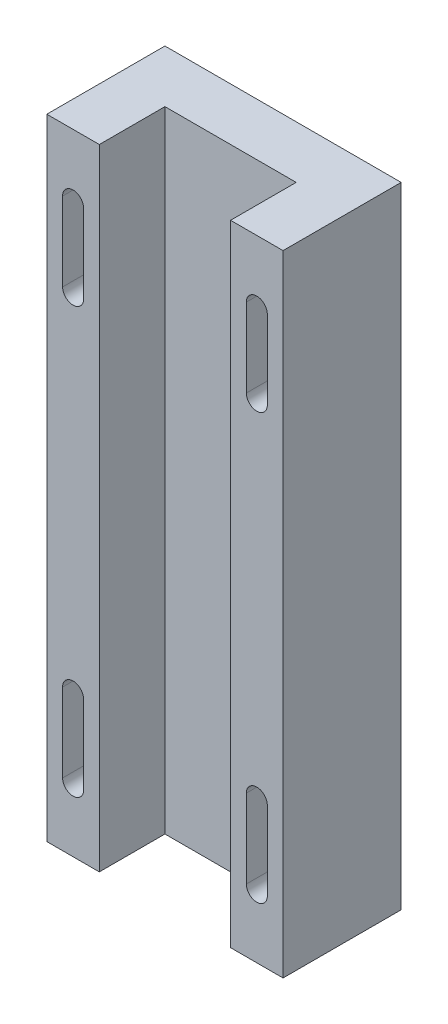
ISO-10303-21;
HEADER;
FILE_DESCRIPTION(('STEP AP214'),'2;1');
FILE_NAME('part.step','',(''),(''),'','','');
FILE_SCHEMA(('AUTOMOTIVE_DESIGN { 1 0 10303 214 1 1 1 1 }'));
ENDSEC;
DATA;
#1=APPLICATION_CONTEXT('core data for automotive mechanical design processes');
#2=APPLICATION_PROTOCOL_DEFINITION('international standard','automotive_design',2000,#1);
#3=PRODUCT_CONTEXT('',#1,'mechanical');
#4=PRODUCT('Part','Part','',(#3));
#5=PRODUCT_RELATED_PRODUCT_CATEGORY('part','',(#4));
#6=PRODUCT_DEFINITION_FORMATION('','',#4);
#7=PRODUCT_DEFINITION_CONTEXT('part definition',#1,'design');
#8=PRODUCT_DEFINITION('design','',#6,#7);
#9=PRODUCT_DEFINITION_SHAPE('','',#8);
#10=(LENGTH_UNIT() NAMED_UNIT(*) SI_UNIT(.MILLI.,.METRE.));
#11=(NAMED_UNIT(*) PLANE_ANGLE_UNIT() SI_UNIT($,.RADIAN.));
#12=(NAMED_UNIT(*) SI_UNIT($,.STERADIAN.) SOLID_ANGLE_UNIT());
#13=UNCERTAINTY_MEASURE_WITH_UNIT(LENGTH_MEASURE(1.E-05),#10,'distance_accuracy_value','');
#14=(GEOMETRIC_REPRESENTATION_CONTEXT(3) GLOBAL_UNCERTAINTY_ASSIGNED_CONTEXT((#13)) GLOBAL_UNIT_ASSIGNED_CONTEXT((#10,
#11,#12)) REPRESENTATION_CONTEXT('',''));
#15=CARTESIAN_POINT('',(0.,0.,0.));
#16=DIRECTION('',(0.,0.,1.));
#17=DIRECTION('',(1.,0.,0.));
#18=AXIS2_PLACEMENT_3D('',#15,#16,#17);
#19=CARTESIAN_POINT('',(0.,120.,0.));
#20=DIRECTION('',(0.,0.,1.));
#21=DIRECTION('',(1.,0.,0.));
#22=AXIS2_PLACEMENT_3D('',#19,#20,#21);
#23=PLANE('',#22);
#24=CARTESIAN_POINT('',(-5.00000000000015,108.,0.));
#25=DIRECTION('',(0.,0.,1.));
#26=DIRECTION('',(1.,0.,0.));
#27=AXIS2_PLACEMENT_3D('',#24,#25,#26);
#28=CIRCLE('',#27,2.);
#29=CARTESIAN_POINT('',(-3.00000000000015,108.,0.));
#30=VERTEX_POINT('',#29);
#31=CARTESIAN_POINT('',(-7.00000000000015,108.,0.));
#32=VERTEX_POINT('',#31);
#33=EDGE_CURVE('E301',#30,#32,#28,.T.);
#34=ORIENTED_EDGE('',*,*,#33,.F.);
#35=DIRECTION('',(0.,-1.,0.));
#36=VECTOR('',#35,1.);
#37=CARTESIAN_POINT('',(-3.00000000000015,108.,0.));
#38=LINE('',#37,#36);
#39=CARTESIAN_POINT('',(-3.00000000000036,93.0000000000002,0.));
#40=VERTEX_POINT('',#39);
#41=EDGE_CURVE('E320',#30,#40,#38,.T.);
#42=ORIENTED_EDGE('',*,*,#41,.T.);
#43=CARTESIAN_POINT('',(-5.00000000000036,93.0000000000003,0.));
#44=DIRECTION('',(0.,0.,-1.));
#45=DIRECTION('',(-1.,0.,0.));
#46=AXIS2_PLACEMENT_3D('',#43,#44,#45);
#47=CIRCLE('',#46,2.);
#48=CARTESIAN_POINT('',(-7.00000000000036,93.0000000000003,0.));
#49=VERTEX_POINT('',#48);
#50=EDGE_CURVE('E324',#40,#49,#47,.T.);
#51=ORIENTED_EDGE('',*,*,#50,.T.);
#52=DIRECTION('',(0.,-1.,0.));
#53=VECTOR('',#52,1.);
#54=CARTESIAN_POINT('',(-7.00000000000015,108.,0.));
#55=LINE('',#54,#53);
#56=EDGE_CURVE('E307',#32,#49,#55,.T.);
#57=ORIENTED_EDGE('',*,*,#56,.F.);
#58=EDGE_LOOP('',(#34,#42,#51,#57));
#59=FACE_BOUND('',#58,.T.);
#60=DIRECTION('',(-1.,0.,0.));
#61=VECTOR('',#60,1.);
#62=CARTESIAN_POINT('',(0.,0.,0.));
#63=LINE('',#62,#61);
#64=CARTESIAN_POINT('',(0.,0.,0.));
#65=VERTEX_POINT('',#64);
#66=CARTESIAN_POINT('',(-10.,0.,0.));
#67=VERTEX_POINT('',#66);
#68=EDGE_CURVE('E388',#65,#67,#63,.T.);
#69=ORIENTED_EDGE('',*,*,#68,.F.);
#70=DIRECTION('',(0.,-1.,0.));
#71=VECTOR('',#70,1.);
#72=CARTESIAN_POINT('',(0.,120.,0.));
#73=LINE('',#72,#71);
#74=CARTESIAN_POINT('',(0.,120.,0.));
#75=VERTEX_POINT('',#74);
#76=EDGE_CURVE('E11',#75,#65,#73,.T.);
#77=ORIENTED_EDGE('',*,*,#76,.F.);
#78=DIRECTION('',(-1.,0.,0.));
#79=VECTOR('',#78,1.);
#80=CARTESIAN_POINT('',(0.,120.,0.));
#81=LINE('',#80,#79);
#82=CARTESIAN_POINT('',(-10.,120.,0.));
#83=VERTEX_POINT('',#82);
#84=EDGE_CURVE('E389',#75,#83,#81,.T.);
#85=ORIENTED_EDGE('',*,*,#84,.T.);
#86=DIRECTION('',(0.,-1.,0.));
#87=VECTOR('',#86,1.);
#88=CARTESIAN_POINT('',(-10.,120.,0.));
#89=LINE('',#88,#87);
#90=EDGE_CURVE('E50',#83,#67,#89,.T.);
#91=ORIENTED_EDGE('',*,*,#90,.T.);
#92=EDGE_LOOP('',(#69,#77,#85,#91));
#93=FACE_BOUND('',#92,.T.);
#94=DIRECTION('',(0.,1.,0.));
#95=VECTOR('',#94,1.);
#96=CARTESIAN_POINT('',(-3.00000000000015,11.9999999999998,0.));
#97=LINE('',#96,#95);
#98=CARTESIAN_POINT('',(-3.00000000000015,11.9999999999998,0.));
#99=VERTEX_POINT('',#98);
#100=CARTESIAN_POINT('',(-3.00000000000036,26.9999999999998,0.));
#101=VERTEX_POINT('',#100);
#102=EDGE_CURVE('E265',#99,#101,#97,.T.);
#103=ORIENTED_EDGE('',*,*,#102,.F.);
#104=CARTESIAN_POINT('',(-5.00000000000015,11.9999999999997,0.));
#105=DIRECTION('',(0.,0.,-1.));
#106=DIRECTION('',(1.,0.,0.));
#107=AXIS2_PLACEMENT_3D('',#104,#105,#106);
#108=CIRCLE('',#107,2.);
#109=CARTESIAN_POINT('',(-7.00000000000015,11.9999999999997,0.));
#110=VERTEX_POINT('',#109);
#111=EDGE_CURVE('E72',#99,#110,#108,.T.);
#112=ORIENTED_EDGE('',*,*,#111,.T.);
#113=DIRECTION('',(0.,1.,0.));
#114=VECTOR('',#113,1.);
#115=CARTESIAN_POINT('',(-7.00000000000015,11.9999999999997,0.));
#116=LINE('',#115,#114);
#117=CARTESIAN_POINT('',(-7.00000000000036,26.9999999999997,0.));
#118=VERTEX_POINT('',#117);
#119=EDGE_CURVE('E279',#110,#118,#116,.T.);
#120=ORIENTED_EDGE('',*,*,#119,.T.);
#121=CARTESIAN_POINT('',(-5.00000000000036,26.9999999999997,0.));
#122=DIRECTION('',(0.,0.,1.));
#123=DIRECTION('',(-1.,0.,0.));
#124=AXIS2_PLACEMENT_3D('',#121,#122,#123);
#125=CIRCLE('',#124,2.);
#126=EDGE_CURVE('E283',#101,#118,#125,.T.);
#127=ORIENTED_EDGE('',*,*,#126,.F.);
#128=EDGE_LOOP('',(#103,#112,#120,#127));
#129=FACE_BOUND('',#128,.T.);
#130=ADVANCED_FACE('F47',(#59,#93,#129),#23,.T.);
#131=CARTESIAN_POINT('',(35.,120.,0.));
#132=DIRECTION('',(0.,0.,1.));
#133=DIRECTION('',(1.,0.,0.));
#134=AXIS2_PLACEMENT_3D('',#131,#132,#133);
#135=PLANE('',#134);
#136=CARTESIAN_POINT('',(30.,12.,0.));
#137=DIRECTION('',(0.,0.,1.));
#138=DIRECTION('',(-1.,0.,0.));
#139=AXIS2_PLACEMENT_3D('',#136,#137,#138);
#140=CIRCLE('',#139,2.);
#141=CARTESIAN_POINT('',(28.,12.,0.));
#142=VERTEX_POINT('',#141);
#143=CARTESIAN_POINT('',(32.,12.,0.));
#144=VERTEX_POINT('',#143);
#145=EDGE_CURVE('E64',#142,#144,#140,.T.);
#146=ORIENTED_EDGE('',*,*,#145,.F.);
#147=DIRECTION('',(0.,1.,0.));
#148=VECTOR('',#147,1.);
#149=CARTESIAN_POINT('',(28.,12.,0.));
#150=LINE('',#149,#148);
#151=CARTESIAN_POINT('',(28.,27.,0.));
#152=VERTEX_POINT('',#151);
#153=EDGE_CURVE('E215',#142,#152,#150,.T.);
#154=ORIENTED_EDGE('',*,*,#153,.T.);
#155=CARTESIAN_POINT('',(30.,27.,0.));
#156=DIRECTION('',(0.,0.,-1.));
#157=DIRECTION('',(1.,0.,0.));
#158=AXIS2_PLACEMENT_3D('',#155,#156,#157);
#159=CIRCLE('',#158,2.);
#160=CARTESIAN_POINT('',(32.,27.,0.));
#161=VERTEX_POINT('',#160);
#162=EDGE_CURVE('E238',#152,#161,#159,.T.);
#163=ORIENTED_EDGE('',*,*,#162,.T.);
#164=DIRECTION('',(0.,1.,0.));
#165=VECTOR('',#164,1.);
#166=CARTESIAN_POINT('',(32.,12.,0.));
#167=LINE('',#166,#165);
#168=EDGE_CURVE('E233',#144,#161,#167,.T.);
#169=ORIENTED_EDGE('',*,*,#168,.F.);
#170=EDGE_LOOP('',(#146,#154,#163,#169));
#171=FACE_BOUND('',#170,.T.);
#172=DIRECTION('',(-1.,0.,0.));
#173=VECTOR('',#172,1.);
#174=CARTESIAN_POINT('',(35.,0.,0.));
#175=LINE('',#174,#173);
#176=CARTESIAN_POINT('',(35.,0.,0.));
#177=VERTEX_POINT('',#176);
#178=CARTESIAN_POINT('',(25.,0.,0.));
#179=VERTEX_POINT('',#178);
#180=EDGE_CURVE('E437',#177,#179,#175,.T.);
#181=ORIENTED_EDGE('',*,*,#180,.F.);
#182=DIRECTION('',(0.,-1.,0.));
#183=VECTOR('',#182,1.);
#184=CARTESIAN_POINT('',(35.,120.,0.));
#185=LINE('',#184,#183);
#186=CARTESIAN_POINT('',(35.,120.,0.));
#187=VERTEX_POINT('',#186);
#188=EDGE_CURVE('E460',#187,#177,#185,.T.);
#189=ORIENTED_EDGE('',*,*,#188,.F.);
#190=DIRECTION('',(-1.,0.,0.));
#191=VECTOR('',#190,1.);
#192=CARTESIAN_POINT('',(35.,120.,0.));
#193=LINE('',#192,#191);
#194=CARTESIAN_POINT('',(25.,120.,0.));
#195=VERTEX_POINT('',#194);
#196=EDGE_CURVE('E406',#187,#195,#193,.T.);
#197=ORIENTED_EDGE('',*,*,#196,.T.);
#198=DIRECTION('',(0.,-1.,0.));
#199=VECTOR('',#198,1.);
#200=CARTESIAN_POINT('',(25.,120.,0.));
#201=LINE('',#200,#199);
#202=EDGE_CURVE('E457',#195,#179,#201,.T.);
#203=ORIENTED_EDGE('',*,*,#202,.T.);
#204=EDGE_LOOP('',(#181,#189,#197,#203));
#205=FACE_BOUND('',#204,.T.);
#206=DIRECTION('',(0.,-1.,0.));
#207=VECTOR('',#206,1.);
#208=CARTESIAN_POINT('',(28.,108.,0.));
#209=LINE('',#208,#207);
#210=CARTESIAN_POINT('',(28.,108.,0.));
#211=VERTEX_POINT('',#210);
#212=CARTESIAN_POINT('',(28.,93.,0.));
#213=VERTEX_POINT('',#212);
#214=EDGE_CURVE('E349',#211,#213,#209,.T.);
#215=ORIENTED_EDGE('',*,*,#214,.F.);
#216=CARTESIAN_POINT('',(30.,108.,0.));
#217=DIRECTION('',(0.,0.,-1.));
#218=DIRECTION('',(-1.,0.,0.));
#219=AXIS2_PLACEMENT_3D('',#216,#217,#218);
#220=CIRCLE('',#219,2.);
#221=CARTESIAN_POINT('',(32.,108.,0.));
#222=VERTEX_POINT('',#221);
#223=EDGE_CURVE('E343',#211,#222,#220,.T.);
#224=ORIENTED_EDGE('',*,*,#223,.T.);
#225=DIRECTION('',(0.,-1.,0.));
#226=VECTOR('',#225,1.);
#227=CARTESIAN_POINT('',(32.,108.,0.));
#228=LINE('',#227,#226);
#229=CARTESIAN_POINT('',(32.,93.,0.));
#230=VERTEX_POINT('',#229);
#231=EDGE_CURVE('E364',#222,#230,#228,.T.);
#232=ORIENTED_EDGE('',*,*,#231,.T.);
#233=CARTESIAN_POINT('',(30.,93.,0.));
#234=DIRECTION('',(0.,0.,1.));
#235=DIRECTION('',(1.,0.,0.));
#236=AXIS2_PLACEMENT_3D('',#233,#234,#235);
#237=CIRCLE('',#236,2.);
#238=EDGE_CURVE('E368',#213,#230,#237,.T.);
#239=ORIENTED_EDGE('',*,*,#238,.F.);
#240=EDGE_LOOP('',(#215,#224,#232,#239));
#241=FACE_BOUND('',#240,.T.);
#242=ADVANCED_FACE('F499',(#171,#205,#241),#135,.T.);
#243=CARTESIAN_POINT('',(0.,120.,-12.5));
#244=DIRECTION('',(1.,0.,0.));
#245=DIRECTION('',(0.,0.,-1.));
#246=AXIS2_PLACEMENT_3D('',#243,#244,#245);
#247=PLANE('',#246);
#248=DIRECTION('',(0.,0.,1.));
#249=VECTOR('',#248,1.);
#250=CARTESIAN_POINT('',(0.,0.,-12.5));
#251=LINE('',#250,#249);
#252=CARTESIAN_POINT('',(0.,0.,-12.5));
#253=VERTEX_POINT('',#252);
#254=EDGE_CURVE('E394',#253,#65,#251,.T.);
#255=ORIENTED_EDGE('',*,*,#254,.F.);
#256=DIRECTION('',(0.,-1.,0.));
#257=VECTOR('',#256,1.);
#258=CARTESIAN_POINT('',(0.,120.,-12.5));
#259=LINE('',#258,#257);
#260=CARTESIAN_POINT('',(0.,120.,-12.5));
#261=VERTEX_POINT('',#260);
#262=EDGE_CURVE('E56',#261,#253,#259,.T.);
#263=ORIENTED_EDGE('',*,*,#262,.F.);
#264=DIRECTION('',(0.,0.,1.));
#265=VECTOR('',#264,1.);
#266=CARTESIAN_POINT('',(0.,120.,-12.5));
#267=LINE('',#266,#265);
#268=EDGE_CURVE('E418',#261,#75,#267,.T.);
#269=ORIENTED_EDGE('',*,*,#268,.T.);
#270=ORIENTED_EDGE('',*,*,#76,.T.);
#271=EDGE_LOOP('',(#255,#263,#269,#270));
#272=FACE_BOUND('',#271,.T.);
#273=ADVANCED_FACE('F484',(#272),#247,.T.);
#274=CARTESIAN_POINT('',(25.,120.,-12.5));
#275=DIRECTION('',(0.,0.,1.));
#276=DIRECTION('',(1.,0.,0.));
#277=AXIS2_PLACEMENT_3D('',#274,#275,#276);
#278=PLANE('',#277);
#279=DIRECTION('',(-1.,0.,0.));
#280=VECTOR('',#279,1.);
#281=CARTESIAN_POINT('',(25.,0.,-12.5));
#282=LINE('',#281,#280);
#283=CARTESIAN_POINT('',(25.,0.,-12.5));
#284=VERTEX_POINT('',#283);
#285=EDGE_CURVE('E445',#284,#253,#282,.T.);
#286=ORIENTED_EDGE('',*,*,#285,.F.);
#287=DIRECTION('',(0.,-1.,0.));
#288=VECTOR('',#287,1.);
#289=CARTESIAN_POINT('',(25.,120.,-12.5));
#290=LINE('',#289,#288);
#291=CARTESIAN_POINT('',(25.,120.,-12.5));
#292=VERTEX_POINT('',#291);
#293=EDGE_CURVE('E454',#292,#284,#290,.T.);
#294=ORIENTED_EDGE('',*,*,#293,.F.);
#295=DIRECTION('',(-1.,0.,0.));
#296=VECTOR('',#295,1.);
#297=CARTESIAN_POINT('',(25.,120.,-12.5));
#298=LINE('',#297,#296);
#299=EDGE_CURVE('E414',#292,#261,#298,.T.);
#300=ORIENTED_EDGE('',*,*,#299,.T.);
#301=ORIENTED_EDGE('',*,*,#262,.T.);
#302=EDGE_LOOP('',(#286,#294,#300,#301));
#303=FACE_BOUND('',#302,.T.);
#304=ADVANCED_FACE('F506',(#303),#278,.T.);
#305=CARTESIAN_POINT('',(25.,120.,0.));
#306=DIRECTION('',(-1.,0.,0.));
#307=DIRECTION('',(0.,0.,1.));
#308=AXIS2_PLACEMENT_3D('',#305,#306,#307);
#309=PLANE('',#308);
#310=DIRECTION('',(0.,0.,-1.));
#311=VECTOR('',#310,1.);
#312=CARTESIAN_POINT('',(25.,0.,0.));
#313=LINE('',#312,#311);
#314=EDGE_CURVE('E441',#179,#284,#313,.T.);
#315=ORIENTED_EDGE('',*,*,#314,.F.);
#316=ORIENTED_EDGE('',*,*,#202,.F.);
#317=DIRECTION('',(0.,0.,-1.));
#318=VECTOR('',#317,1.);
#319=CARTESIAN_POINT('',(25.,120.,0.));
#320=LINE('',#319,#318);
#321=EDGE_CURVE('E410',#195,#292,#320,.T.);
#322=ORIENTED_EDGE('',*,*,#321,.T.);
#323=ORIENTED_EDGE('',*,*,#293,.T.);
#324=EDGE_LOOP('',(#315,#316,#322,#323));
#325=FACE_BOUND('',#324,.T.);
#326=ADVANCED_FACE('F504',(#325),#309,.T.);
#327=CARTESIAN_POINT('',(35.,120.,-22.5));
#328=DIRECTION('',(1.,0.,0.));
#329=DIRECTION('',(0.,0.,-1.));
#330=AXIS2_PLACEMENT_3D('',#327,#328,#329);
#331=PLANE('',#330);
#332=DIRECTION('',(0.,0.,1.));
#333=VECTOR('',#332,1.);
#334=CARTESIAN_POINT('',(35.,0.,-22.5));
#335=LINE('',#334,#333);
#336=CARTESIAN_POINT('',(35.,0.,-22.5));
#337=VERTEX_POINT('',#336);
#338=EDGE_CURVE('E433',#337,#177,#335,.T.);
#339=ORIENTED_EDGE('',*,*,#338,.F.);
#340=DIRECTION('',(0.,-1.,0.));
#341=VECTOR('',#340,1.);
#342=CARTESIAN_POINT('',(35.,120.,-22.5));
#343=LINE('',#342,#341);
#344=CARTESIAN_POINT('',(35.,120.,-22.5));
#345=VERTEX_POINT('',#344);
#346=EDGE_CURVE('E463',#345,#337,#343,.T.);
#347=ORIENTED_EDGE('',*,*,#346,.F.);
#348=DIRECTION('',(0.,0.,1.));
#349=VECTOR('',#348,1.);
#350=CARTESIAN_POINT('',(35.,120.,-22.5));
#351=LINE('',#350,#349);
#352=EDGE_CURVE('E402',#345,#187,#351,.T.);
#353=ORIENTED_EDGE('',*,*,#352,.T.);
#354=ORIENTED_EDGE('',*,*,#188,.T.);
#355=EDGE_LOOP('',(#339,#347,#353,#354));
#356=FACE_BOUND('',#355,.T.);
#357=ADVANCED_FACE('F497',(#356),#331,.T.);
#358=CARTESIAN_POINT('',(-10.,120.,-22.5));
#359=DIRECTION('',(0.,0.,-1.));
#360=DIRECTION('',(-1.,0.,0.));
#361=AXIS2_PLACEMENT_3D('',#358,#359,#360);
#362=PLANE('',#361);
#363=DIRECTION('',(1.,0.,0.));
#364=VECTOR('',#363,1.);
#365=CARTESIAN_POINT('',(-10.,0.,-22.5));
#366=LINE('',#365,#364);
#367=CARTESIAN_POINT('',(-10.,0.,-22.5));
#368=VERTEX_POINT('',#367);
#369=EDGE_CURVE('E429',#368,#337,#366,.T.);
#370=ORIENTED_EDGE('',*,*,#369,.F.);
#371=DIRECTION('',(0.,-1.,0.));
#372=VECTOR('',#371,1.);
#373=CARTESIAN_POINT('',(-10.,120.,-22.5));
#374=LINE('',#373,#372);
#375=CARTESIAN_POINT('',(-10.,120.,-22.5));
#376=VERTEX_POINT('',#375);
#377=EDGE_CURVE('E465',#376,#368,#374,.T.);
#378=ORIENTED_EDGE('',*,*,#377,.F.);
#379=DIRECTION('',(1.,0.,0.));
#380=VECTOR('',#379,1.);
#381=CARTESIAN_POINT('',(-10.,120.,-22.5));
#382=LINE('',#381,#380);
#383=EDGE_CURVE('E398',#376,#345,#382,.T.);
#384=ORIENTED_EDGE('',*,*,#383,.T.);
#385=ORIENTED_EDGE('',*,*,#346,.T.);
#386=EDGE_LOOP('',(#370,#378,#384,#385));
#387=FACE_BOUND('',#386,.T.);
#388=ADVANCED_FACE('F493',(#387),#362,.T.);
#389=CARTESIAN_POINT('',(-10.,120.,0.));
#390=DIRECTION('',(-1.,0.,0.));
#391=DIRECTION('',(0.,0.,1.));
#392=AXIS2_PLACEMENT_3D('',#389,#390,#391);
#393=PLANE('',#392);
#394=DIRECTION('',(0.,0.,-1.));
#395=VECTOR('',#394,1.);
#396=CARTESIAN_POINT('',(-10.,0.,0.));
#397=LINE('',#396,#395);
#398=EDGE_CURVE('E425',#67,#368,#397,.T.);
#399=ORIENTED_EDGE('',*,*,#398,.F.);
#400=ORIENTED_EDGE('',*,*,#90,.F.);
#401=DIRECTION('',(0.,0.,-1.));
#402=VECTOR('',#401,1.);
#403=CARTESIAN_POINT('',(-10.,120.,0.));
#404=LINE('',#403,#402);
#405=EDGE_CURVE('E393',#83,#376,#404,.T.);
#406=ORIENTED_EDGE('',*,*,#405,.T.);
#407=ORIENTED_EDGE('',*,*,#377,.T.);
#408=EDGE_LOOP('',(#399,#400,#406,#407));
#409=FACE_BOUND('',#408,.T.);
#410=ADVANCED_FACE('F478',(#409),#393,.T.);
#411=CARTESIAN_POINT('',(0.,120.,0.));
#412=DIRECTION('',(0.,-1.,0.));
#413=DIRECTION('',(0.,0.,-1.));
#414=AXIS2_PLACEMENT_3D('',#411,#412,#413);
#415=PLANE('',#414);
#416=ORIENTED_EDGE('',*,*,#84,.F.);
#417=ORIENTED_EDGE('',*,*,#268,.F.);
#418=ORIENTED_EDGE('',*,*,#299,.F.);
#419=ORIENTED_EDGE('',*,*,#321,.F.);
#420=ORIENTED_EDGE('',*,*,#196,.F.);
#421=ORIENTED_EDGE('',*,*,#352,.F.);
#422=ORIENTED_EDGE('',*,*,#383,.F.);
#423=ORIENTED_EDGE('',*,*,#405,.F.);
#424=EDGE_LOOP('',(#416,#417,#418,#419,#420,#421,#422,#423));
#425=FACE_BOUND('',#424,.T.);
#426=ADVANCED_FACE('F487',(#425),#415,.F.);
#427=CARTESIAN_POINT('',(0.,0.,0.));
#428=DIRECTION('',(0.,-1.,0.));
#429=DIRECTION('',(0.,0.,-1.));
#430=AXIS2_PLACEMENT_3D('',#427,#428,#429);
#431=PLANE('',#430);
#432=ORIENTED_EDGE('',*,*,#68,.T.);
#433=ORIENTED_EDGE('',*,*,#398,.T.);
#434=ORIENTED_EDGE('',*,*,#369,.T.);
#435=ORIENTED_EDGE('',*,*,#338,.T.);
#436=ORIENTED_EDGE('',*,*,#180,.T.);
#437=ORIENTED_EDGE('',*,*,#314,.T.);
#438=ORIENTED_EDGE('',*,*,#285,.T.);
#439=ORIENTED_EDGE('',*,*,#254,.T.);
#440=EDGE_LOOP('',(#432,#433,#434,#435,#436,#437,#438,#439));
#441=FACE_BOUND('',#440,.T.);
#442=ADVANCED_FACE('F480',(#441),#431,.T.);
#443=CARTESIAN_POINT('',(30.,108.,-4.));
#444=DIRECTION('',(0.,0.,1.));
#445=DIRECTION('',(1.,0.,0.));
#446=AXIS2_PLACEMENT_3D('',#443,#444,#445);
#447=CYLINDRICAL_SURFACE('',#446,2.);
#448=ORIENTED_EDGE('',*,*,#223,.F.);
#449=DIRECTION('',(0.,0.,1.));
#450=VECTOR('',#449,1.);
#451=CARTESIAN_POINT('',(28.,108.,-4.));
#452=LINE('',#451,#450);
#453=CARTESIAN_POINT('',(28.,108.,-4.));
#454=VERTEX_POINT('',#453);
#455=EDGE_CURVE('E360',#454,#211,#452,.T.);
#456=ORIENTED_EDGE('',*,*,#455,.F.);
#457=CARTESIAN_POINT('',(30.,108.,-4.));
#458=DIRECTION('',(0.,0.,-1.));
#459=DIRECTION('',(-1.,0.,0.));
#460=AXIS2_PLACEMENT_3D('',#457,#458,#459);
#461=CIRCLE('',#460,2.);
#462=CARTESIAN_POINT('',(32.,108.,-4.));
#463=VERTEX_POINT('',#462);
#464=EDGE_CURVE('E344',#454,#463,#461,.T.);
#465=ORIENTED_EDGE('',*,*,#464,.T.);
#466=DIRECTION('',(0.,0.,1.));
#467=VECTOR('',#466,1.);
#468=CARTESIAN_POINT('',(32.,108.,-4.));
#469=LINE('',#468,#467);
#470=EDGE_CURVE('E384',#463,#222,#469,.T.);
#471=ORIENTED_EDGE('',*,*,#470,.T.);
#472=EDGE_LOOP('',(#448,#456,#465,#471));
#473=FACE_BOUND('',#472,.T.);
#474=ADVANCED_FACE('F570',(#473),#447,.F.);
#475=CARTESIAN_POINT('',(32.,108.,-4.));
#476=DIRECTION('',(-1.,0.,0.));
#477=DIRECTION('',(0.,0.,1.));
#478=AXIS2_PLACEMENT_3D('',#475,#476,#477);
#479=PLANE('',#478);
#480=ORIENTED_EDGE('',*,*,#231,.F.);
#481=ORIENTED_EDGE('',*,*,#470,.F.);
#482=DIRECTION('',(0.,-1.,0.));
#483=VECTOR('',#482,1.);
#484=CARTESIAN_POINT('',(32.,108.,-4.));
#485=LINE('',#484,#483);
#486=CARTESIAN_POINT('',(32.,93.,-4.));
#487=VERTEX_POINT('',#486);
#488=EDGE_CURVE('E348',#463,#487,#485,.T.);
#489=ORIENTED_EDGE('',*,*,#488,.T.);
#490=DIRECTION('',(0.,0.,1.));
#491=VECTOR('',#490,1.);
#492=CARTESIAN_POINT('',(32.,93.,-4.));
#493=LINE('',#492,#491);
#494=EDGE_CURVE('E381',#487,#230,#493,.T.);
#495=ORIENTED_EDGE('',*,*,#494,.T.);
#496=EDGE_LOOP('',(#480,#481,#489,#495));
#497=FACE_BOUND('',#496,.T.);
#498=ADVANCED_FACE('F566',(#497),#479,.T.);
#499=CARTESIAN_POINT('',(30.,93.,-4.));
#500=DIRECTION('',(0.,0.,1.));
#501=DIRECTION('',(1.,0.,0.));
#502=AXIS2_PLACEMENT_3D('',#499,#500,#501);
#503=CYLINDRICAL_SURFACE('',#502,2.);
#504=ORIENTED_EDGE('',*,*,#238,.T.);
#505=ORIENTED_EDGE('',*,*,#494,.F.);
#506=CARTESIAN_POINT('',(30.,93.,-4.));
#507=DIRECTION('',(0.,0.,1.));
#508=DIRECTION('',(1.,0.,0.));
#509=AXIS2_PLACEMENT_3D('',#506,#507,#508);
#510=CIRCLE('',#509,2.);
#511=CARTESIAN_POINT('',(28.,93.,-4.));
#512=VERTEX_POINT('',#511);
#513=EDGE_CURVE('E352',#512,#487,#510,.T.);
#514=ORIENTED_EDGE('',*,*,#513,.F.);
#515=DIRECTION('',(0.,0.,1.));
#516=VECTOR('',#515,1.);
#517=CARTESIAN_POINT('',(28.,93.,-4.));
#518=LINE('',#517,#516);
#519=EDGE_CURVE('E378',#512,#213,#518,.T.);
#520=ORIENTED_EDGE('',*,*,#519,.T.);
#521=EDGE_LOOP('',(#504,#505,#514,#520));
#522=FACE_BOUND('',#521,.T.);
#523=ADVANCED_FACE('F562',(#522),#503,.F.);
#524=CARTESIAN_POINT('',(28.,108.,-4.));
#525=DIRECTION('',(-1.,0.,0.));
#526=DIRECTION('',(0.,-1.,0.));
#527=AXIS2_PLACEMENT_3D('',#524,#525,#526);
#528=PLANE('',#527);
#529=ORIENTED_EDGE('',*,*,#214,.T.);
#530=ORIENTED_EDGE('',*,*,#519,.F.);
#531=DIRECTION('',(0.,-1.,0.));
#532=VECTOR('',#531,1.);
#533=CARTESIAN_POINT('',(28.,108.,-4.));
#534=LINE('',#533,#532);
#535=EDGE_CURVE('E356',#454,#512,#534,.T.);
#536=ORIENTED_EDGE('',*,*,#535,.F.);
#537=ORIENTED_EDGE('',*,*,#455,.T.);
#538=EDGE_LOOP('',(#529,#530,#536,#537));
#539=FACE_BOUND('',#538,.T.);
#540=ADVANCED_FACE('F558',(#539),#528,.F.);
#541=CARTESIAN_POINT('',(30.,108.,-4.));
#542=DIRECTION('',(0.,0.,-1.));
#543=DIRECTION('',(-1.,0.,0.));
#544=AXIS2_PLACEMENT_3D('',#541,#542,#543);
#545=PLANE('',#544);
#546=ORIENTED_EDGE('',*,*,#464,.F.);
#547=ORIENTED_EDGE('',*,*,#535,.T.);
#548=ORIENTED_EDGE('',*,*,#513,.T.);
#549=ORIENTED_EDGE('',*,*,#488,.F.);
#550=EDGE_LOOP('',(#546,#547,#548,#549));
#551=FACE_BOUND('',#550,.T.);
#552=ADVANCED_FACE('F555',(#551),#545,.F.);
#553=CARTESIAN_POINT('',(-5.00000000000015,108.,-3.99999999999997));
#554=DIRECTION('',(0.,0.,1.));
#555=DIRECTION('',(1.,0.,0.));
#556=AXIS2_PLACEMENT_3D('',#553,#554,#555);
#557=CYLINDRICAL_SURFACE('',#556,2.);
#558=ORIENTED_EDGE('',*,*,#33,.T.);
#559=DIRECTION('',(0.,0.,1.));
#560=VECTOR('',#559,1.);
#561=CARTESIAN_POINT('',(-7.00000000000016,108.,-3.99999999999997));
#562=LINE('',#561,#560);
#563=CARTESIAN_POINT('',(-7.00000000000016,108.,-3.99999999999997));
#564=VERTEX_POINT('',#563);
#565=EDGE_CURVE('E317',#564,#32,#562,.T.);
#566=ORIENTED_EDGE('',*,*,#565,.F.);
#567=CARTESIAN_POINT('',(-5.00000000000015,108.,-3.99999999999997));
#568=DIRECTION('',(0.,0.,1.));
#569=DIRECTION('',(1.,0.,0.));
#570=AXIS2_PLACEMENT_3D('',#567,#568,#569);
#571=CIRCLE('',#570,2.);
#572=CARTESIAN_POINT('',(-3.00000000000016,108.,-3.99999999999997));
#573=VERTEX_POINT('',#572);
#574=EDGE_CURVE('E302',#573,#564,#571,.T.);
#575=ORIENTED_EDGE('',*,*,#574,.F.);
#576=DIRECTION('',(0.,0.,1.));
#577=VECTOR('',#576,1.);
#578=CARTESIAN_POINT('',(-3.00000000000016,108.,-3.99999999999997));
#579=LINE('',#578,#577);
#580=EDGE_CURVE('E340',#573,#30,#579,.T.);
#581=ORIENTED_EDGE('',*,*,#580,.T.);
#582=EDGE_LOOP('',(#558,#566,#575,#581));
#583=FACE_BOUND('',#582,.T.);
#584=ADVANCED_FACE('F527',(#583),#557,.F.);
#585=CARTESIAN_POINT('',(-3.00000000000016,108.,-3.99999999999997));
#586=DIRECTION('',(-1.,0.,0.));
#587=DIRECTION('',(0.,-1.,0.));
#588=AXIS2_PLACEMENT_3D('',#585,#586,#587);
#589=PLANE('',#588);
#590=ORIENTED_EDGE('',*,*,#41,.F.);
#591=ORIENTED_EDGE('',*,*,#580,.F.);
#592=DIRECTION('',(0.,-1.,0.));
#593=VECTOR('',#592,1.);
#594=CARTESIAN_POINT('',(-3.00000000000016,108.,-3.99999999999997));
#595=LINE('',#594,#593);
#596=CARTESIAN_POINT('',(-3.00000000000037,93.0000000000002,-3.99999999999997));
#597=VERTEX_POINT('',#596);
#598=EDGE_CURVE('E306',#573,#597,#595,.T.);
#599=ORIENTED_EDGE('',*,*,#598,.T.);
#600=DIRECTION('',(0.,0.,1.));
#601=VECTOR('',#600,1.);
#602=CARTESIAN_POINT('',(-3.00000000000037,93.0000000000002,-3.99999999999997));
#603=LINE('',#602,#601);
#604=EDGE_CURVE('E337',#597,#40,#603,.T.);
#605=ORIENTED_EDGE('',*,*,#604,.T.);
#606=EDGE_LOOP('',(#590,#591,#599,#605));
#607=FACE_BOUND('',#606,.T.);
#608=ADVANCED_FACE('F539',(#607),#589,.T.);
#609=CARTESIAN_POINT('',(-5.00000000000037,93.0000000000003,-3.99999999999997));
#610=DIRECTION('',(0.,0.,1.));
#611=DIRECTION('',(1.,0.,0.));
#612=AXIS2_PLACEMENT_3D('',#609,#610,#611);
#613=CYLINDRICAL_SURFACE('',#612,2.);
#614=ORIENTED_EDGE('',*,*,#50,.F.);
#615=ORIENTED_EDGE('',*,*,#604,.F.);
#616=CARTESIAN_POINT('',(-5.00000000000037,93.0000000000003,-3.99999999999997));
#617=DIRECTION('',(0.,0.,-1.));
#618=DIRECTION('',(-1.,0.,0.));
#619=AXIS2_PLACEMENT_3D('',#616,#617,#618);
#620=CIRCLE('',#619,2.);
#621=CARTESIAN_POINT('',(-7.00000000000036,93.0000000000003,-3.99999999999997));
#622=VERTEX_POINT('',#621);
#623=EDGE_CURVE('E310',#597,#622,#620,.T.);
#624=ORIENTED_EDGE('',*,*,#623,.T.);
#625=DIRECTION('',(0.,0.,1.));
#626=VECTOR('',#625,1.);
#627=CARTESIAN_POINT('',(-7.00000000000036,93.0000000000003,-3.99999999999997));
#628=LINE('',#627,#626);
#629=EDGE_CURVE('E334',#622,#49,#628,.T.);
#630=ORIENTED_EDGE('',*,*,#629,.T.);
#631=EDGE_LOOP('',(#614,#615,#624,#630));
#632=FACE_BOUND('',#631,.T.);
#633=ADVANCED_FACE('F542',(#632),#613,.F.);
#634=CARTESIAN_POINT('',(-7.00000000000016,108.,-3.99999999999997));
#635=DIRECTION('',(-1.,0.,0.));
#636=DIRECTION('',(0.,-1.,0.));
#637=AXIS2_PLACEMENT_3D('',#634,#635,#636);
#638=PLANE('',#637);
#639=ORIENTED_EDGE('',*,*,#56,.T.);
#640=ORIENTED_EDGE('',*,*,#629,.F.);
#641=DIRECTION('',(0.,-1.,0.));
#642=VECTOR('',#641,1.);
#643=CARTESIAN_POINT('',(-7.00000000000016,108.,-3.99999999999997));
#644=LINE('',#643,#642);
#645=EDGE_CURVE('E313',#564,#622,#644,.T.);
#646=ORIENTED_EDGE('',*,*,#645,.F.);
#647=ORIENTED_EDGE('',*,*,#565,.T.);
#648=EDGE_LOOP('',(#639,#640,#646,#647));
#649=FACE_BOUND('',#648,.T.);
#650=ADVANCED_FACE('F531',(#649),#638,.F.);
#651=CARTESIAN_POINT('',(-5.00000000000015,108.,-3.99999999999997));
#652=DIRECTION('',(0.,0.,-1.));
#653=DIRECTION('',(1.,0.,0.));
#654=AXIS2_PLACEMENT_3D('',#651,#652,#653);
#655=PLANE('',#654);
#656=ORIENTED_EDGE('',*,*,#574,.T.);
#657=ORIENTED_EDGE('',*,*,#645,.T.);
#658=ORIENTED_EDGE('',*,*,#623,.F.);
#659=ORIENTED_EDGE('',*,*,#598,.F.);
#660=EDGE_LOOP('',(#656,#657,#658,#659));
#661=FACE_BOUND('',#660,.T.);
#662=ADVANCED_FACE('F535',(#661),#655,.F.);
#663=CARTESIAN_POINT('',(-5.00000000000015,11.9999999999997,-3.99999999999997));
#664=DIRECTION('',(0.,0.,1.));
#665=DIRECTION('',(1.,0.,0.));
#666=AXIS2_PLACEMENT_3D('',#663,#664,#665);
#667=CYLINDRICAL_SURFACE('',#666,2.);
#668=ORIENTED_EDGE('',*,*,#111,.F.);
#669=DIRECTION('',(0.,0.,1.));
#670=VECTOR('',#669,1.);
#671=CARTESIAN_POINT('',(-3.00000000000016,11.9999999999998,-3.99999999999997));
#672=LINE('',#671,#670);
#673=CARTESIAN_POINT('',(-3.00000000000016,11.9999999999998,-3.99999999999997));
#674=VERTEX_POINT('',#673);
#675=EDGE_CURVE('E276',#674,#99,#672,.T.);
#676=ORIENTED_EDGE('',*,*,#675,.F.);
#677=CARTESIAN_POINT('',(-5.00000000000015,11.9999999999997,-3.99999999999997));
#678=DIRECTION('',(0.,0.,-1.));
#679=DIRECTION('',(1.,0.,0.));
#680=AXIS2_PLACEMENT_3D('',#677,#678,#679);
#681=CIRCLE('',#680,2.);
#682=CARTESIAN_POINT('',(-7.00000000000016,11.9999999999997,-3.99999999999997));
#683=VERTEX_POINT('',#682);
#684=EDGE_CURVE('E260',#674,#683,#681,.T.);
#685=ORIENTED_EDGE('',*,*,#684,.T.);
#686=DIRECTION('',(0.,0.,1.));
#687=VECTOR('',#686,1.);
#688=CARTESIAN_POINT('',(-7.00000000000016,11.9999999999997,-3.99999999999997));
#689=LINE('',#688,#687);
#690=EDGE_CURVE('E298',#683,#110,#689,.T.);
#691=ORIENTED_EDGE('',*,*,#690,.T.);
#692=EDGE_LOOP('',(#668,#676,#685,#691));
#693=FACE_BOUND('',#692,.T.);
#694=ADVANCED_FACE('F638',(#693),#667,.F.);
#695=CARTESIAN_POINT('',(-7.00000000000016,11.9999999999997,-3.99999999999997));
#696=DIRECTION('',(1.,0.,0.));
#697=DIRECTION('',(0.,1.,0.));
#698=AXIS2_PLACEMENT_3D('',#695,#696,#697);
#699=PLANE('',#698);
#700=ORIENTED_EDGE('',*,*,#119,.F.);
#701=ORIENTED_EDGE('',*,*,#690,.F.);
#702=DIRECTION('',(0.,1.,0.));
#703=VECTOR('',#702,1.);
#704=CARTESIAN_POINT('',(-7.00000000000016,11.9999999999997,-3.99999999999997));
#705=LINE('',#704,#703);
#706=CARTESIAN_POINT('',(-7.00000000000036,26.9999999999997,-3.99999999999997));
#707=VERTEX_POINT('',#706);
#708=EDGE_CURVE('E264',#683,#707,#705,.T.);
#709=ORIENTED_EDGE('',*,*,#708,.T.);
#710=DIRECTION('',(0.,0.,1.));
#711=VECTOR('',#710,1.);
#712=CARTESIAN_POINT('',(-7.00000000000036,26.9999999999997,-3.99999999999997));
#713=LINE('',#712,#711);
#714=EDGE_CURVE('E295',#707,#118,#713,.T.);
#715=ORIENTED_EDGE('',*,*,#714,.T.);
#716=EDGE_LOOP('',(#700,#701,#709,#715));
#717=FACE_BOUND('',#716,.T.);
#718=ADVANCED_FACE('F650',(#717),#699,.T.);
#719=CARTESIAN_POINT('',(-5.00000000000037,26.9999999999997,-3.99999999999997));
#720=DIRECTION('',(0.,0.,1.));
#721=DIRECTION('',(1.,0.,0.));
#722=AXIS2_PLACEMENT_3D('',#719,#720,#721);
#723=CYLINDRICAL_SURFACE('',#722,2.);
#724=ORIENTED_EDGE('',*,*,#126,.T.);
#725=ORIENTED_EDGE('',*,*,#714,.F.);
#726=CARTESIAN_POINT('',(-5.00000000000037,26.9999999999997,-3.99999999999997));
#727=DIRECTION('',(0.,0.,1.));
#728=DIRECTION('',(-1.,0.,0.));
#729=AXIS2_PLACEMENT_3D('',#726,#727,#728);
#730=CIRCLE('',#729,2.);
#731=CARTESIAN_POINT('',(-3.00000000000037,26.9999999999998,-3.99999999999997));
#732=VERTEX_POINT('',#731);
#733=EDGE_CURVE('E268',#732,#707,#730,.T.);
#734=ORIENTED_EDGE('',*,*,#733,.F.);
#735=DIRECTION('',(0.,0.,1.));
#736=VECTOR('',#735,1.);
#737=CARTESIAN_POINT('',(-3.00000000000037,26.9999999999998,-3.99999999999997));
#738=LINE('',#737,#736);
#739=EDGE_CURVE('E292',#732,#101,#738,.T.);
#740=ORIENTED_EDGE('',*,*,#739,.T.);
#741=EDGE_LOOP('',(#724,#725,#734,#740));
#742=FACE_BOUND('',#741,.T.);
#743=ADVANCED_FACE('F659',(#742),#723,.F.);
#744=CARTESIAN_POINT('',(-3.00000000000016,11.9999999999998,-3.99999999999997));
#745=DIRECTION('',(1.,0.,0.));
#746=DIRECTION('',(0.,1.,0.));
#747=AXIS2_PLACEMENT_3D('',#744,#745,#746);
#748=PLANE('',#747);
#749=ORIENTED_EDGE('',*,*,#102,.T.);
#750=ORIENTED_EDGE('',*,*,#739,.F.);
#751=DIRECTION('',(0.,1.,0.));
#752=VECTOR('',#751,1.);
#753=CARTESIAN_POINT('',(-3.00000000000016,11.9999999999998,-3.99999999999997));
#754=LINE('',#753,#752);
#755=EDGE_CURVE('E272',#674,#732,#754,.T.);
#756=ORIENTED_EDGE('',*,*,#755,.F.);
#757=ORIENTED_EDGE('',*,*,#675,.T.);
#758=EDGE_LOOP('',(#749,#750,#756,#757));
#759=FACE_BOUND('',#758,.T.);
#760=ADVANCED_FACE('F669',(#759),#748,.F.);
#761=CARTESIAN_POINT('',(-5.00000000000015,11.9999999999997,-3.99999999999997));
#762=DIRECTION('',(0.,0.,-1.));
#763=DIRECTION('',(1.,0.,0.));
#764=AXIS2_PLACEMENT_3D('',#761,#762,#763);
#765=PLANE('',#764);
#766=ORIENTED_EDGE('',*,*,#684,.F.);
#767=ORIENTED_EDGE('',*,*,#755,.T.);
#768=ORIENTED_EDGE('',*,*,#733,.T.);
#769=ORIENTED_EDGE('',*,*,#708,.F.);
#770=EDGE_LOOP('',(#766,#767,#768,#769));
#771=FACE_BOUND('',#770,.T.);
#772=ADVANCED_FACE('F679',(#771),#765,.F.);
#773=CARTESIAN_POINT('',(30.,12.,-4.));
#774=DIRECTION('',(0.,0.,1.));
#775=DIRECTION('',(1.,0.,0.));
#776=AXIS2_PLACEMENT_3D('',#773,#774,#775);
#777=CYLINDRICAL_SURFACE('',#776,2.);
#778=ORIENTED_EDGE('',*,*,#145,.T.);
#779=DIRECTION('',(0.,0.,1.));
#780=VECTOR('',#779,1.);
#781=CARTESIAN_POINT('',(32.,12.,-4.));
#782=LINE('',#781,#780);
#783=CARTESIAN_POINT('',(32.,12.,-4.));
#784=VERTEX_POINT('',#783);
#785=EDGE_CURVE('E231',#784,#144,#782,.T.);
#786=ORIENTED_EDGE('',*,*,#785,.F.);
#787=CARTESIAN_POINT('',(30.,12.,-4.));
#788=DIRECTION('',(0.,0.,1.));
#789=DIRECTION('',(-1.,0.,0.));
#790=AXIS2_PLACEMENT_3D('',#787,#788,#789);
#791=CIRCLE('',#790,2.);
#792=CARTESIAN_POINT('',(28.,12.,-4.));
#793=VERTEX_POINT('',#792);
#794=EDGE_CURVE('E225',#793,#784,#791,.T.);
#795=ORIENTED_EDGE('',*,*,#794,.F.);
#796=DIRECTION('',(0.,0.,1.));
#797=VECTOR('',#796,1.);
#798=CARTESIAN_POINT('',(28.,12.,-4.));
#799=LINE('',#798,#797);
#800=EDGE_CURVE('E209',#793,#142,#799,.T.);
#801=ORIENTED_EDGE('',*,*,#800,.T.);
#802=EDGE_LOOP('',(#778,#786,#795,#801));
#803=FACE_BOUND('',#802,.T.);
#804=ADVANCED_FACE('F230',(#803),#777,.F.);
#805=CARTESIAN_POINT('',(28.,12.,-4.));
#806=DIRECTION('',(1.,0.,0.));
#807=DIRECTION('',(0.,1.,0.));
#808=AXIS2_PLACEMENT_3D('',#805,#806,#807);
#809=PLANE('',#808);
#810=ORIENTED_EDGE('',*,*,#153,.F.);
#811=ORIENTED_EDGE('',*,*,#800,.F.);
#812=DIRECTION('',(0.,1.,0.));
#813=VECTOR('',#812,1.);
#814=CARTESIAN_POINT('',(28.,12.,-4.));
#815=LINE('',#814,#813);
#816=CARTESIAN_POINT('',(28.,27.,-4.));
#817=VERTEX_POINT('',#816);
#818=EDGE_CURVE('E212',#793,#817,#815,.T.);
#819=ORIENTED_EDGE('',*,*,#818,.T.);
#820=DIRECTION('',(0.,0.,1.));
#821=VECTOR('',#820,1.);
#822=CARTESIAN_POINT('',(28.,27.,-4.));
#823=LINE('',#822,#821);
#824=EDGE_CURVE('E218',#817,#152,#823,.T.);
#825=ORIENTED_EDGE('',*,*,#824,.T.);
#826=EDGE_LOOP('',(#810,#811,#819,#825));
#827=FACE_BOUND('',#826,.T.);
#828=ADVANCED_FACE('F211',(#827),#809,.T.);
#829=CARTESIAN_POINT('',(30.,27.,-4.));
#830=DIRECTION('',(0.,0.,1.));
#831=DIRECTION('',(1.,0.,0.));
#832=AXIS2_PLACEMENT_3D('',#829,#830,#831);
#833=CYLINDRICAL_SURFACE('',#832,2.);
#834=ORIENTED_EDGE('',*,*,#162,.F.);
#835=ORIENTED_EDGE('',*,*,#824,.F.);
#836=CARTESIAN_POINT('',(30.,27.,-4.));
#837=DIRECTION('',(0.,0.,-1.));
#838=DIRECTION('',(1.,0.,0.));
#839=AXIS2_PLACEMENT_3D('',#836,#837,#838);
#840=CIRCLE('',#839,2.);
#841=CARTESIAN_POINT('',(32.,27.,-4.));
#842=VERTEX_POINT('',#841);
#843=EDGE_CURVE('E227',#817,#842,#840,.T.);
#844=ORIENTED_EDGE('',*,*,#843,.T.);
#845=DIRECTION('',(0.,0.,1.));
#846=VECTOR('',#845,1.);
#847=CARTESIAN_POINT('',(32.,27.,-4.));
#848=LINE('',#847,#846);
#849=EDGE_CURVE('E255',#842,#161,#848,.T.);
#850=ORIENTED_EDGE('',*,*,#849,.T.);
#851=EDGE_LOOP('',(#834,#835,#844,#850));
#852=FACE_BOUND('',#851,.T.);
#853=ADVANCED_FACE('F706',(#852),#833,.F.);
#854=CARTESIAN_POINT('',(32.,12.,-4.));
#855=DIRECTION('',(1.,0.,0.));
#856=DIRECTION('',(0.,0.,-1.));
#857=AXIS2_PLACEMENT_3D('',#854,#855,#856);
#858=PLANE('',#857);
#859=ORIENTED_EDGE('',*,*,#168,.T.);
#860=ORIENTED_EDGE('',*,*,#849,.F.);
#861=DIRECTION('',(0.,1.,0.));
#862=VECTOR('',#861,1.);
#863=CARTESIAN_POINT('',(32.,12.,-4.));
#864=LINE('',#863,#862);
#865=EDGE_CURVE('E243',#784,#842,#864,.T.);
#866=ORIENTED_EDGE('',*,*,#865,.F.);
#867=ORIENTED_EDGE('',*,*,#785,.T.);
#868=EDGE_LOOP('',(#859,#860,#866,#867));
#869=FACE_BOUND('',#868,.T.);
#870=ADVANCED_FACE('F715',(#869),#858,.F.);
#871=CARTESIAN_POINT('',(30.,12.,-4.));
#872=DIRECTION('',(0.,0.,-1.));
#873=DIRECTION('',(-1.,0.,0.));
#874=AXIS2_PLACEMENT_3D('',#871,#872,#873);
#875=PLANE('',#874);
#876=ORIENTED_EDGE('',*,*,#794,.T.);
#877=ORIENTED_EDGE('',*,*,#865,.T.);
#878=ORIENTED_EDGE('',*,*,#843,.F.);
#879=ORIENTED_EDGE('',*,*,#818,.F.);
#880=EDGE_LOOP('',(#876,#877,#878,#879));
#881=FACE_BOUND('',#880,.T.);
#882=ADVANCED_FACE('F223',(#881),#875,.F.);
#883=CLOSED_SHELL('',(#130,#242,#273,#304,#326,#357,#388,#410,#426,#442,#474,#498,#523,#540,
#552,#584,#608,#633,#650,#662,#694,#718,#743,#760,#772,#804,#828,#853,#870,#882));
#884=MANIFOLD_SOLID_BREP('B2',#883);
#885=ADVANCED_BREP_SHAPE_REPRESENTATION('',(#18,#884),#14);
#886=SHAPE_DEFINITION_REPRESENTATION(#9,#885);
ENDSEC;
END-ISO-10303-21;
